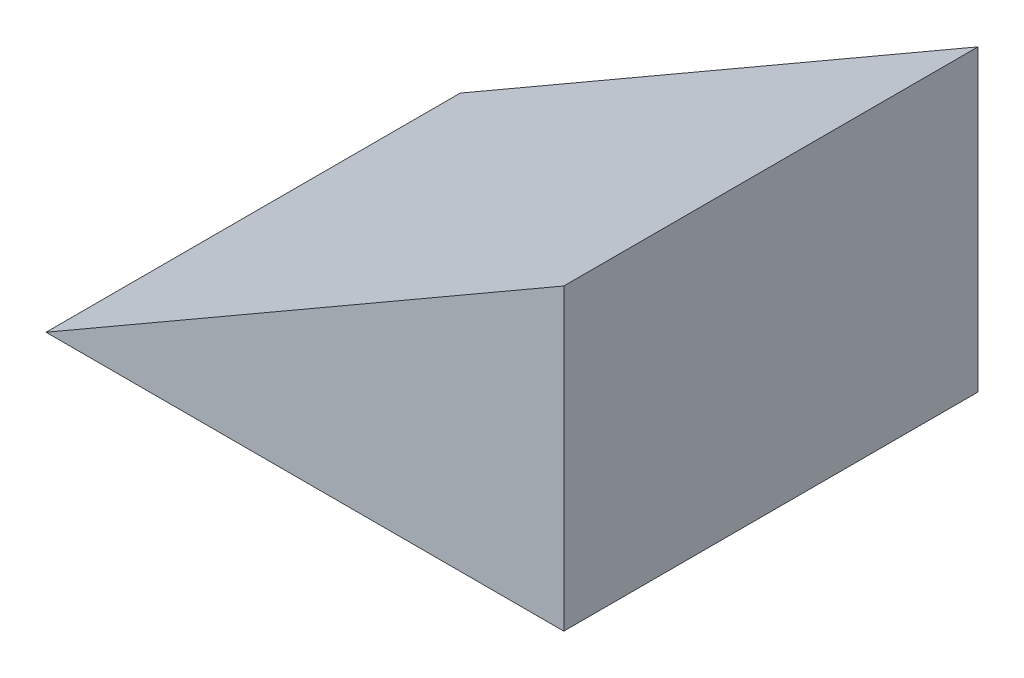
ISO-10303-21;
HEADER;
FILE_DESCRIPTION(('STEP AP214'),'2;1');
FILE_NAME('part.step','',(''),(''),'','','');
FILE_SCHEMA(('AUTOMOTIVE_DESIGN { 1 0 10303 214 1 1 1 1 }'));
ENDSEC;
DATA;
#1=APPLICATION_CONTEXT('core data for automotive mechanical design processes');
#2=APPLICATION_PROTOCOL_DEFINITION('international standard','automotive_design',2000,#1);
#3=PRODUCT_CONTEXT('',#1,'mechanical');
#4=PRODUCT('Part','Part','',(#3));
#5=PRODUCT_RELATED_PRODUCT_CATEGORY('part','',(#4));
#6=PRODUCT_DEFINITION_FORMATION('','',#4);
#7=PRODUCT_DEFINITION_CONTEXT('part definition',#1,'design');
#8=PRODUCT_DEFINITION('design','',#6,#7);
#9=PRODUCT_DEFINITION_SHAPE('','',#8);
#10=(LENGTH_UNIT() NAMED_UNIT(*) SI_UNIT(.MILLI.,.METRE.));
#11=(NAMED_UNIT(*) PLANE_ANGLE_UNIT() SI_UNIT($,.RADIAN.));
#12=(NAMED_UNIT(*) SI_UNIT($,.STERADIAN.) SOLID_ANGLE_UNIT());
#13=UNCERTAINTY_MEASURE_WITH_UNIT(LENGTH_MEASURE(1.E-05),#10,'distance_accuracy_value','');
#14=(GEOMETRIC_REPRESENTATION_CONTEXT(3) GLOBAL_UNCERTAINTY_ASSIGNED_CONTEXT((#13)) GLOBAL_UNIT_ASSIGNED_CONTEXT((#10,
#11,#12)) REPRESENTATION_CONTEXT('',''));
#15=CARTESIAN_POINT('',(0.,0.,0.));
#16=DIRECTION('',(0.,0.,1.));
#17=DIRECTION('',(1.,0.,0.));
#18=AXIS2_PLACEMENT_3D('',#15,#16,#17);
#19=CARTESIAN_POINT('',(0.,0.,40.));
#20=DIRECTION('',(0.,1.,0.));
#21=DIRECTION('',(0.,0.,1.));
#22=AXIS2_PLACEMENT_3D('',#19,#20,#21);
#23=PLANE('',#22);
#24=DIRECTION('',(1.,0.,0.));
#25=VECTOR('',#24,1.);
#26=CARTESIAN_POINT('',(0.,0.,0.));
#27=LINE('',#26,#25);
#28=CARTESIAN_POINT('',(0.,0.,0.));
#29=VERTEX_POINT('',#28);
#30=CARTESIAN_POINT('',(50.,0.,0.));
#31=VERTEX_POINT('',#30);
#32=EDGE_CURVE('E90',#29,#31,#27,.T.);
#33=ORIENTED_EDGE('',*,*,#32,.T.);
#34=DIRECTION('',(0.,0.,-1.));
#35=VECTOR('',#34,1.);
#36=CARTESIAN_POINT('',(50.,0.,40.));
#37=LINE('',#36,#35);
#38=CARTESIAN_POINT('',(50.,0.,40.));
#39=VERTEX_POINT('',#38);
#40=EDGE_CURVE('E11',#39,#31,#37,.T.);
#41=ORIENTED_EDGE('',*,*,#40,.F.);
#42=DIRECTION('',(1.,0.,0.));
#43=VECTOR('',#42,1.);
#44=CARTESIAN_POINT('',(0.,0.,40.));
#45=LINE('',#44,#43);
#46=CARTESIAN_POINT('',(0.,0.,40.));
#47=VERTEX_POINT('',#46);
#48=EDGE_CURVE('E84',#47,#39,#45,.T.);
#49=ORIENTED_EDGE('',*,*,#48,.F.);
#50=DIRECTION('',(0.,0.,-1.));
#51=VECTOR('',#50,1.);
#52=CARTESIAN_POINT('',(0.,0.,40.));
#53=LINE('',#52,#51);
#54=EDGE_CURVE('E58',#47,#29,#53,.T.);
#55=ORIENTED_EDGE('',*,*,#54,.T.);
#56=EDGE_LOOP('',(#33,#41,#49,#55));
#57=FACE_BOUND('',#56,.T.);
#58=ADVANCED_FACE('F41',(#57),#23,.F.);
#59=CARTESIAN_POINT('',(50.,0.,40.));
#60=DIRECTION('',(-1.,0.,0.));
#61=DIRECTION('',(0.,-1.,0.));
#62=AXIS2_PLACEMENT_3D('',#59,#60,#61);
#63=PLANE('',#62);
#64=DIRECTION('',(0.,1.,0.));
#65=VECTOR('',#64,1.);
#66=CARTESIAN_POINT('',(50.,0.,0.));
#67=LINE('',#66,#65);
#68=CARTESIAN_POINT('',(50.,28.8675134594814,0.));
#69=VERTEX_POINT('',#68);
#70=EDGE_CURVE('E94',#31,#69,#67,.T.);
#71=ORIENTED_EDGE('',*,*,#70,.T.);
#72=DIRECTION('',(0.,0.,-1.));
#73=VECTOR('',#72,1.);
#74=CARTESIAN_POINT('',(50.,28.8675134594814,40.));
#75=LINE('',#74,#73);
#76=CARTESIAN_POINT('',(50.,28.8675134594814,40.));
#77=VERTEX_POINT('',#76);
#78=EDGE_CURVE('E50',#77,#69,#75,.T.);
#79=ORIENTED_EDGE('',*,*,#78,.F.);
#80=DIRECTION('',(0.,1.,0.));
#81=VECTOR('',#80,1.);
#82=CARTESIAN_POINT('',(50.,0.,40.));
#83=LINE('',#82,#81);
#84=EDGE_CURVE('E76',#39,#77,#83,.T.);
#85=ORIENTED_EDGE('',*,*,#84,.F.);
#86=ORIENTED_EDGE('',*,*,#40,.T.);
#87=EDGE_LOOP('',(#71,#79,#85,#86));
#88=FACE_BOUND('',#87,.T.);
#89=ADVANCED_FACE('F78',(#88),#63,.F.);
#90=CARTESIAN_POINT('',(0.,0.,40.));
#91=DIRECTION('',(-0.500000000000001,0.866025403784438,0.));
#92=DIRECTION('',(-0.866025403784438,-0.500000000000001,0.));
#93=AXIS2_PLACEMENT_3D('',#90,#91,#92);
#94=PLANE('',#93);
#95=DIRECTION('',(0.866025403784438,0.500000000000001,0.));
#96=VECTOR('',#95,1.);
#97=CARTESIAN_POINT('',(0.,0.,0.));
#98=LINE('',#97,#96);
#99=EDGE_CURVE('E88',#29,#69,#98,.T.);
#100=ORIENTED_EDGE('',*,*,#99,.F.);
#101=ORIENTED_EDGE('',*,*,#54,.F.);
#102=DIRECTION('',(0.866025403784438,0.500000000000001,0.));
#103=VECTOR('',#102,1.);
#104=CARTESIAN_POINT('',(0.,0.,40.));
#105=LINE('',#104,#103);
#106=EDGE_CURVE('E83',#47,#77,#105,.T.);
#107=ORIENTED_EDGE('',*,*,#106,.T.);
#108=ORIENTED_EDGE('',*,*,#78,.T.);
#109=EDGE_LOOP('',(#100,#101,#107,#108));
#110=FACE_BOUND('',#109,.T.);
#111=ADVANCED_FACE('F105',(#110),#94,.T.);
#112=CARTESIAN_POINT('',(0.,0.,40.));
#113=DIRECTION('',(0.,0.,1.));
#114=DIRECTION('',(1.,0.,0.));
#115=AXIS2_PLACEMENT_3D('',#112,#113,#114);
#116=PLANE('',#115);
#117=ORIENTED_EDGE('',*,*,#48,.T.);
#118=ORIENTED_EDGE('',*,*,#84,.T.);
#119=ORIENTED_EDGE('',*,*,#106,.F.);
#120=EDGE_LOOP('',(#117,#118,#119));
#121=FACE_BOUND('',#120,.T.);
#122=ADVANCED_FACE('F86',(#121),#116,.T.);
#123=CARTESIAN_POINT('',(0.,0.,0.));
#124=DIRECTION('',(0.,0.,1.));
#125=DIRECTION('',(1.,0.,0.));
#126=AXIS2_PLACEMENT_3D('',#123,#124,#125);
#127=PLANE('',#126);
#128=ORIENTED_EDGE('',*,*,#32,.F.);
#129=ORIENTED_EDGE('',*,*,#99,.T.);
#130=ORIENTED_EDGE('',*,*,#70,.F.);
#131=EDGE_LOOP('',(#128,#129,#130));
#132=FACE_BOUND('',#131,.T.);
#133=ADVANCED_FACE('F112',(#132),#127,.F.);
#134=CLOSED_SHELL('',(#58,#89,#111,#122,#133));
#135=MANIFOLD_SOLID_BREP('B2',#134);
#136=ADVANCED_BREP_SHAPE_REPRESENTATION('',(#18,#135),#14);
#137=SHAPE_DEFINITION_REPRESENTATION(#9,#136);
ENDSEC;
END-ISO-10303-21;
